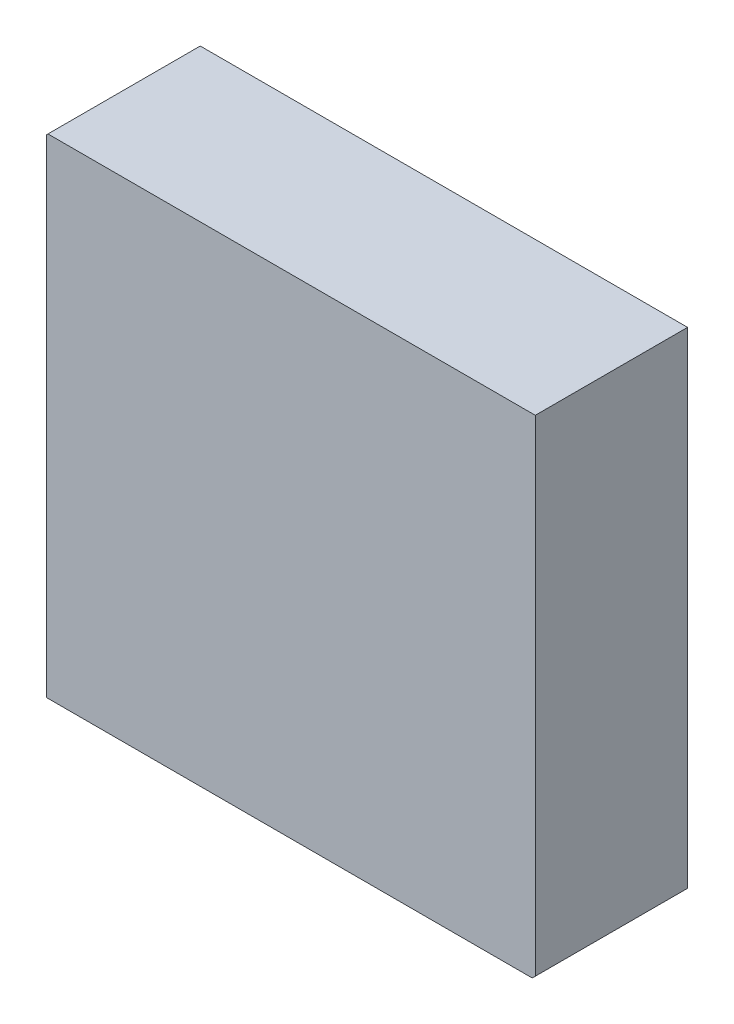
ISO-10303-21;
HEADER;
FILE_DESCRIPTION(('STEP AP214'),'2;1');
FILE_NAME('part.step','',(''),(''),'','','');
FILE_SCHEMA(('AUTOMOTIVE_DESIGN { 1 0 10303 214 1 1 1 1 }'));
ENDSEC;
DATA;
#1=APPLICATION_CONTEXT('core data for automotive mechanical design processes');
#2=APPLICATION_PROTOCOL_DEFINITION('international standard','automotive_design',2000,#1);
#3=PRODUCT_CONTEXT('',#1,'mechanical');
#4=PRODUCT('Part','Part','',(#3));
#5=PRODUCT_RELATED_PRODUCT_CATEGORY('part','',(#4));
#6=PRODUCT_DEFINITION_FORMATION('','',#4);
#7=PRODUCT_DEFINITION_CONTEXT('part definition',#1,'design');
#8=PRODUCT_DEFINITION('design','',#6,#7);
#9=PRODUCT_DEFINITION_SHAPE('','',#8);
#10=(LENGTH_UNIT() NAMED_UNIT(*) SI_UNIT(.MILLI.,.METRE.));
#11=(NAMED_UNIT(*) PLANE_ANGLE_UNIT() SI_UNIT($,.RADIAN.));
#12=(NAMED_UNIT(*) SI_UNIT($,.STERADIAN.) SOLID_ANGLE_UNIT());
#13=UNCERTAINTY_MEASURE_WITH_UNIT(LENGTH_MEASURE(1.E-05),#10,'distance_accuracy_value','');
#14=(GEOMETRIC_REPRESENTATION_CONTEXT(3) GLOBAL_UNCERTAINTY_ASSIGNED_CONTEXT((#13)) GLOBAL_UNIT_ASSIGNED_CONTEXT((#10,
#11,#12)) REPRESENTATION_CONTEXT('',''));
#15=CARTESIAN_POINT('',(0.,0.,0.));
#16=DIRECTION('',(0.,0.,1.));
#17=DIRECTION('',(1.,0.,0.));
#18=AXIS2_PLACEMENT_3D('',#15,#16,#17);
#19=CARTESIAN_POINT('',(-0.79750158,0.8025003,0.5));
#20=DIRECTION('',(0.,0.,-1.));
#21=DIRECTION('',(-1.,0.,0.));
#22=AXIS2_PLACEMENT_3D('',#19,#20,#21);
#23=PLANE('',#22);
#24=DIRECTION('',(0.,1.,0.));
#25=VECTOR('',#24,1.);
#26=CARTESIAN_POINT('',(-0.8025003,0.79750158,0.5));
#27=LINE('',#26,#25);
#28=CARTESIAN_POINT('',(-0.802500300000002,0.797501580000002,0.5));
#29=VERTEX_POINT('',#28);
#30=CARTESIAN_POINT('',(-0.8025003,-0.8025003,0.5));
#31=VERTEX_POINT('',#30);
#32=EDGE_CURVE('E98',#29,#31,#27,.F.);
#33=ORIENTED_EDGE('',*,*,#32,.T.);
#34=DIRECTION('',(1.,0.,0.));
#35=VECTOR('',#34,1.);
#36=CARTESIAN_POINT('',(-0.8025003,-0.8025003,0.5));
#37=LINE('',#36,#35);
#38=CARTESIAN_POINT('',(0.79249778,-0.8025003,0.5));
#39=VERTEX_POINT('',#38);
#40=EDGE_CURVE('E94',#31,#39,#37,.T.);
#41=ORIENTED_EDGE('',*,*,#40,.T.);
#42=DIRECTION('',(-0.707106781186548,-0.707106781186548,0.));
#43=VECTOR('',#42,1.);
#44=CARTESIAN_POINT('',(0.79249778,-0.8025003,0.5));
#45=LINE('',#44,#43);
#46=CARTESIAN_POINT('',(0.8025003,-0.79249778,0.5));
#47=VERTEX_POINT('',#46);
#48=EDGE_CURVE('E68',#39,#47,#45,.F.);
#49=ORIENTED_EDGE('',*,*,#48,.T.);
#50=DIRECTION('',(0.,1.,0.));
#51=VECTOR('',#50,1.);
#52=CARTESIAN_POINT('',(0.8025003,-0.79249778,0.5));
#53=LINE('',#52,#51);
#54=CARTESIAN_POINT('',(0.8025003,0.8025003,0.5));
#55=VERTEX_POINT('',#54);
#56=EDGE_CURVE('E71',#47,#55,#53,.T.);
#57=ORIENTED_EDGE('',*,*,#56,.T.);
#58=DIRECTION('',(1.,0.,0.));
#59=VECTOR('',#58,1.);
#60=CARTESIAN_POINT('',(0.8025003,0.8025003,0.5));
#61=LINE('',#60,#59);
#62=CARTESIAN_POINT('',(-0.79750158,0.8025003,0.5));
#63=VERTEX_POINT('',#62);
#64=EDGE_CURVE('E73',#55,#63,#61,.F.);
#65=ORIENTED_EDGE('',*,*,#64,.T.);
#66=DIRECTION('',(0.707106781186548,0.707106781186548,0.));
#67=VECTOR('',#66,1.);
#68=CARTESIAN_POINT('',(-0.8025003,0.79750158,0.5));
#69=LINE('',#68,#67);
#70=EDGE_CURVE('E20',#29,#63,#69,.T.);
#71=ORIENTED_EDGE('',*,*,#70,.F.);
#72=EDGE_LOOP('',(#33,#41,#49,#57,#65,#71));
#73=FACE_BOUND('',#72,.T.);
#74=ADVANCED_FACE('F17',(#73),#23,.F.);
#75=CARTESIAN_POINT('',(0.8025003,0.8025003,0.));
#76=DIRECTION('',(0.,-1.,0.));
#77=DIRECTION('',(0.,0.,-1.));
#78=AXIS2_PLACEMENT_3D('',#75,#76,#77);
#79=PLANE('',#78);
#80=DIRECTION('',(0.,0.,1.));
#81=VECTOR('',#80,1.);
#82=CARTESIAN_POINT('',(-0.79750158,0.8025003,0.));
#83=LINE('',#82,#81);
#84=CARTESIAN_POINT('',(-0.79750158,0.8025003,0.));
#85=VERTEX_POINT('',#84);
#86=EDGE_CURVE('E84',#85,#63,#83,.T.);
#87=ORIENTED_EDGE('',*,*,#86,.T.);
#88=ORIENTED_EDGE('',*,*,#64,.F.);
#89=DIRECTION('',(0.,0.,1.));
#90=VECTOR('',#89,1.);
#91=CARTESIAN_POINT('',(0.8025003,0.8025003,0.));
#92=LINE('',#91,#90);
#93=CARTESIAN_POINT('',(0.8025003,0.8025003,0.));
#94=VERTEX_POINT('',#93);
#95=EDGE_CURVE('E78',#55,#94,#92,.F.);
#96=ORIENTED_EDGE('',*,*,#95,.T.);
#97=DIRECTION('',(-1.,0.,0.));
#98=VECTOR('',#97,1.);
#99=CARTESIAN_POINT('',(-0.79750158,0.8025003,0.));
#100=LINE('',#99,#98);
#101=EDGE_CURVE('E104',#85,#94,#100,.F.);
#102=ORIENTED_EDGE('',*,*,#101,.F.);
#103=EDGE_LOOP('',(#87,#88,#96,#102));
#104=FACE_BOUND('',#103,.T.);
#105=ADVANCED_FACE('F81',(#104),#79,.F.);
#106=CARTESIAN_POINT('',(0.8025003,-0.79249778,0.));
#107=DIRECTION('',(-1.,0.,0.));
#108=DIRECTION('',(0.,0.,1.));
#109=AXIS2_PLACEMENT_3D('',#106,#107,#108);
#110=PLANE('',#109);
#111=ORIENTED_EDGE('',*,*,#95,.F.);
#112=ORIENTED_EDGE('',*,*,#56,.F.);
#113=DIRECTION('',(0.,0.,1.));
#114=VECTOR('',#113,1.);
#115=CARTESIAN_POINT('',(0.8025003,-0.79249778,0.));
#116=LINE('',#115,#114);
#117=CARTESIAN_POINT('',(0.8025003,-0.79249778,0.));
#118=VERTEX_POINT('',#117);
#119=EDGE_CURVE('E90',#47,#118,#116,.F.);
#120=ORIENTED_EDGE('',*,*,#119,.T.);
#121=DIRECTION('',(0.,1.,0.));
#122=VECTOR('',#121,1.);
#123=CARTESIAN_POINT('',(0.8025003,0.8025003,0.));
#124=LINE('',#123,#122);
#125=EDGE_CURVE('E87',#94,#118,#124,.F.);
#126=ORIENTED_EDGE('',*,*,#125,.F.);
#127=EDGE_LOOP('',(#111,#112,#120,#126));
#128=FACE_BOUND('',#127,.T.);
#129=ADVANCED_FACE('F85',(#128),#110,.F.);
#130=CARTESIAN_POINT('',(0.79249778,-0.8025003,0.));
#131=DIRECTION('',(-0.707106781186548,0.707106781186548,0.));
#132=DIRECTION('',(-0.707106781186548,-0.707106781186548,0.));
#133=AXIS2_PLACEMENT_3D('',#130,#131,#132);
#134=PLANE('',#133);
#135=ORIENTED_EDGE('',*,*,#119,.F.);
#136=ORIENTED_EDGE('',*,*,#48,.F.);
#137=DIRECTION('',(0.,0.,1.));
#138=VECTOR('',#137,1.);
#139=CARTESIAN_POINT('',(0.79249778,-0.8025003,0.));
#140=LINE('',#139,#138);
#141=CARTESIAN_POINT('',(0.79249778,-0.8025003,0.));
#142=VERTEX_POINT('',#141);
#143=EDGE_CURVE('E96',#39,#142,#140,.F.);
#144=ORIENTED_EDGE('',*,*,#143,.T.);
#145=DIRECTION('',(-0.707106781186548,-0.707106781186548,0.));
#146=VECTOR('',#145,1.);
#147=CARTESIAN_POINT('',(0.8025003,-0.79249778,0.));
#148=LINE('',#147,#146);
#149=EDGE_CURVE('E107',#118,#142,#148,.T.);
#150=ORIENTED_EDGE('',*,*,#149,.F.);
#151=EDGE_LOOP('',(#135,#136,#144,#150));
#152=FACE_BOUND('',#151,.T.);
#153=ADVANCED_FACE('F124',(#152),#134,.F.);
#154=CARTESIAN_POINT('',(-0.8025003,-0.8025003,0.));
#155=DIRECTION('',(0.,1.,0.));
#156=DIRECTION('',(0.,0.,1.));
#157=AXIS2_PLACEMENT_3D('',#154,#155,#156);
#158=PLANE('',#157);
#159=ORIENTED_EDGE('',*,*,#143,.F.);
#160=ORIENTED_EDGE('',*,*,#40,.F.);
#161=DIRECTION('',(0.,0.,-1.));
#162=VECTOR('',#161,1.);
#163=CARTESIAN_POINT('',(-0.8025003,-0.8025003,0.));
#164=LINE('',#163,#162);
#165=CARTESIAN_POINT('',(-0.8025003,-0.8025003,0.));
#166=VERTEX_POINT('',#165);
#167=EDGE_CURVE('E100',#31,#166,#164,.T.);
#168=ORIENTED_EDGE('',*,*,#167,.T.);
#169=DIRECTION('',(-1.,0.,0.));
#170=VECTOR('',#169,1.);
#171=CARTESIAN_POINT('',(-0.79750158,-0.8025003,0.));
#172=LINE('',#171,#170);
#173=EDGE_CURVE('E110',#142,#166,#172,.T.);
#174=ORIENTED_EDGE('',*,*,#173,.F.);
#175=EDGE_LOOP('',(#159,#160,#168,#174));
#176=FACE_BOUND('',#175,.T.);
#177=ADVANCED_FACE('F122',(#176),#158,.F.);
#178=CARTESIAN_POINT('',(-0.8025003,0.79750158,0.));
#179=DIRECTION('',(1.,0.,0.));
#180=DIRECTION('',(0.,0.,-1.));
#181=AXIS2_PLACEMENT_3D('',#178,#179,#180);
#182=PLANE('',#181);
#183=ORIENTED_EDGE('',*,*,#167,.F.);
#184=ORIENTED_EDGE('',*,*,#32,.F.);
#185=DIRECTION('',(0.,0.,1.));
#186=VECTOR('',#185,1.);
#187=CARTESIAN_POINT('',(-0.802500300000007,0.797501580000007,0.));
#188=LINE('',#187,#186);
#189=CARTESIAN_POINT('',(-0.802500300000002,0.797501580000002,0.));
#190=VERTEX_POINT('',#189);
#191=EDGE_CURVE('E35',#29,#190,#188,.F.);
#192=ORIENTED_EDGE('',*,*,#191,.T.);
#193=DIRECTION('',(0.,1.,0.));
#194=VECTOR('',#193,1.);
#195=CARTESIAN_POINT('',(-0.8025003,0.8025003,0.));
#196=LINE('',#195,#194);
#197=EDGE_CURVE('E26',#166,#190,#196,.T.);
#198=ORIENTED_EDGE('',*,*,#197,.F.);
#199=EDGE_LOOP('',(#183,#184,#192,#198));
#200=FACE_BOUND('',#199,.T.);
#201=ADVANCED_FACE('F118',(#200),#182,.F.);
#202=CARTESIAN_POINT('',(-0.79750158,0.8025003,0.));
#203=DIRECTION('',(0.707106781185548,-0.707106781187548,0.));
#204=DIRECTION('',(0.707106781187548,0.707106781185548,0.));
#205=AXIS2_PLACEMENT_3D('',#202,#203,#204);
#206=PLANE('',#205);
#207=ORIENTED_EDGE('',*,*,#191,.F.);
#208=ORIENTED_EDGE('',*,*,#70,.T.);
#209=ORIENTED_EDGE('',*,*,#86,.F.);
#210=DIRECTION('',(0.707106781186548,0.707106781186548,0.));
#211=VECTOR('',#210,1.);
#212=CARTESIAN_POINT('',(-0.8025003,0.79750158,0.));
#213=LINE('',#212,#211);
#214=EDGE_CURVE('E11',#190,#85,#213,.T.);
#215=ORIENTED_EDGE('',*,*,#214,.F.);
#216=EDGE_LOOP('',(#207,#208,#209,#215));
#217=FACE_BOUND('',#216,.T.);
#218=ADVANCED_FACE('F127',(#217),#206,.F.);
#219=CARTESIAN_POINT('',(-0.79750158,0.8025003,0.));
#220=DIRECTION('',(0.,0.,-1.));
#221=DIRECTION('',(-1.,0.,0.));
#222=AXIS2_PLACEMENT_3D('',#219,#220,#221);
#223=PLANE('',#222);
#224=ORIENTED_EDGE('',*,*,#197,.T.);
#225=ORIENTED_EDGE('',*,*,#214,.T.);
#226=ORIENTED_EDGE('',*,*,#101,.T.);
#227=ORIENTED_EDGE('',*,*,#125,.T.);
#228=ORIENTED_EDGE('',*,*,#149,.T.);
#229=ORIENTED_EDGE('',*,*,#173,.T.);
#230=EDGE_LOOP('',(#224,#225,#226,#227,#228,#229));
#231=FACE_BOUND('',#230,.T.);
#232=ADVANCED_FACE('F115',(#231),#223,.T.);
#233=CLOSED_SHELL('',(#74,#105,#129,#153,#177,#201,#218,#232));
#234=MANIFOLD_SOLID_BREP('B1',#233);
#235=ADVANCED_BREP_SHAPE_REPRESENTATION('',(#18,#234),#14);
#236=SHAPE_DEFINITION_REPRESENTATION(#9,#235);
ENDSEC;
END-ISO-10303-21;
